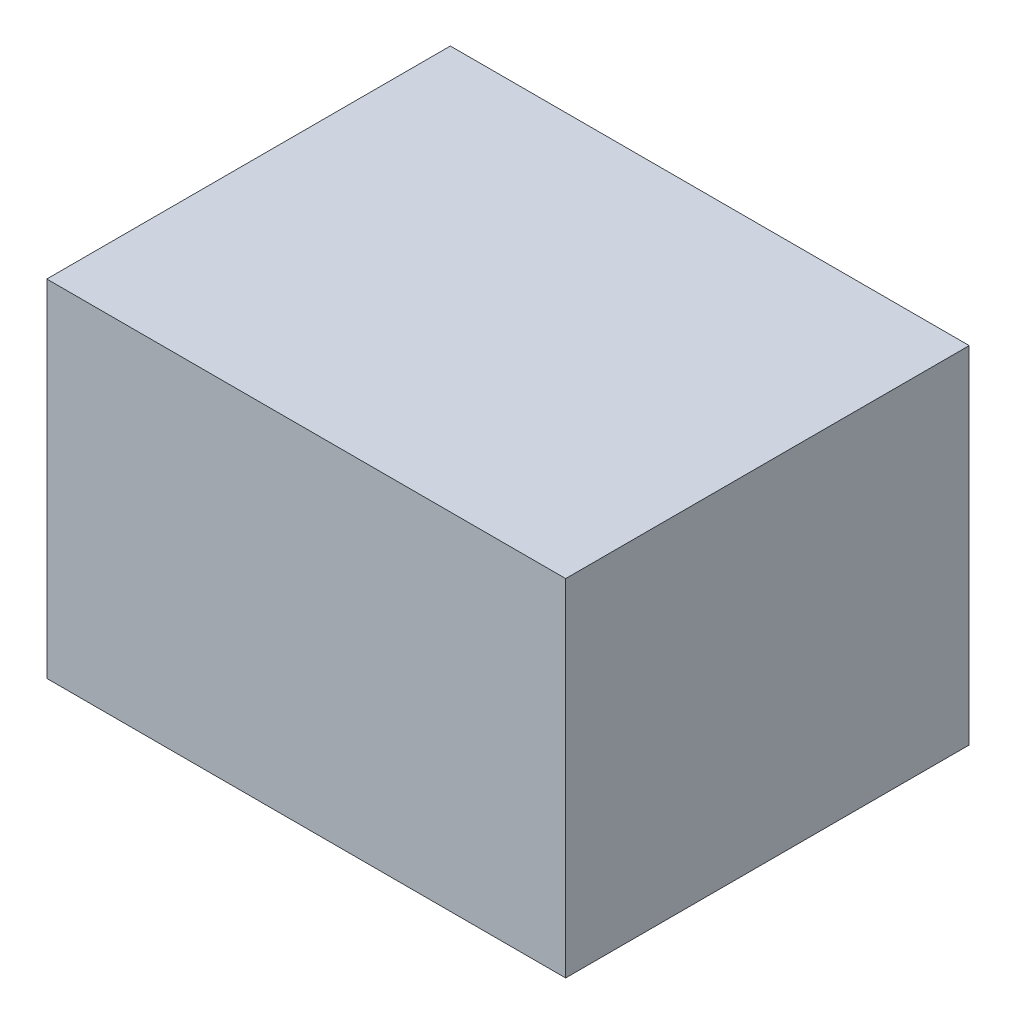
ISO-10303-21;
HEADER;
FILE_DESCRIPTION(('STEP AP214'),'2;1');
FILE_NAME('part.step','',(''),(''),'','','');
FILE_SCHEMA(('AUTOMOTIVE_DESIGN { 1 0 10303 214 1 1 1 1 }'));
ENDSEC;
DATA;
#1=APPLICATION_CONTEXT('core data for automotive mechanical design processes');
#2=APPLICATION_PROTOCOL_DEFINITION('international standard','automotive_design',2000,#1);
#3=PRODUCT_CONTEXT('',#1,'mechanical');
#4=PRODUCT('Part','Part','',(#3));
#5=PRODUCT_RELATED_PRODUCT_CATEGORY('part','',(#4));
#6=PRODUCT_DEFINITION_FORMATION('','',#4);
#7=PRODUCT_DEFINITION_CONTEXT('part definition',#1,'design');
#8=PRODUCT_DEFINITION('design','',#6,#7);
#9=PRODUCT_DEFINITION_SHAPE('','',#8);
#10=(LENGTH_UNIT() NAMED_UNIT(*) SI_UNIT(.MILLI.,.METRE.));
#11=(NAMED_UNIT(*) PLANE_ANGLE_UNIT() SI_UNIT($,.RADIAN.));
#12=(NAMED_UNIT(*) SI_UNIT($,.STERADIAN.) SOLID_ANGLE_UNIT());
#13=UNCERTAINTY_MEASURE_WITH_UNIT(LENGTH_MEASURE(1.E-05),#10,'distance_accuracy_value','');
#14=(GEOMETRIC_REPRESENTATION_CONTEXT(3) GLOBAL_UNCERTAINTY_ASSIGNED_CONTEXT((#13)) GLOBAL_UNIT_ASSIGNED_CONTEXT((#10,
#11,#12)) REPRESENTATION_CONTEXT('',''));
#15=CARTESIAN_POINT('',(0.,0.,0.));
#16=DIRECTION('',(0.,0.,1.));
#17=DIRECTION('',(1.,0.,0.));
#18=AXIS2_PLACEMENT_3D('',#15,#16,#17);
#19=CARTESIAN_POINT('',(-22.5,-15.,35.));
#20=DIRECTION('',(-1.,0.,0.));
#21=DIRECTION('',(0.,0.,1.));
#22=AXIS2_PLACEMENT_3D('',#19,#20,#21);
#23=PLANE('',#22);
#24=DIRECTION('',(0.,1.,0.));
#25=VECTOR('',#24,1.);
#26=CARTESIAN_POINT('',(-22.5,-15.,0.));
#27=LINE('',#26,#25);
#28=CARTESIAN_POINT('',(-22.5,-15.,0.));
#29=VERTEX_POINT('',#28);
#30=CARTESIAN_POINT('',(-22.5,15.,0.));
#31=VERTEX_POINT('',#30);
#32=EDGE_CURVE('E98',#29,#31,#27,.T.);
#33=ORIENTED_EDGE('',*,*,#32,.F.);
#34=DIRECTION('',(0.,0.,-1.));
#35=VECTOR('',#34,1.);
#36=CARTESIAN_POINT('',(-22.5,-15.,35.));
#37=LINE('',#36,#35);
#38=CARTESIAN_POINT('',(-22.5,-15.,35.));
#39=VERTEX_POINT('',#38);
#40=EDGE_CURVE('E11',#39,#29,#37,.T.);
#41=ORIENTED_EDGE('',*,*,#40,.F.);
#42=DIRECTION('',(0.,1.,0.));
#43=VECTOR('',#42,1.);
#44=CARTESIAN_POINT('',(-22.5,-15.,35.));
#45=LINE('',#44,#43);
#46=CARTESIAN_POINT('',(-22.5,15.,35.));
#47=VERTEX_POINT('',#46);
#48=EDGE_CURVE('E93',#39,#47,#45,.T.);
#49=ORIENTED_EDGE('',*,*,#48,.T.);
#50=DIRECTION('',(0.,0.,-1.));
#51=VECTOR('',#50,1.);
#52=CARTESIAN_POINT('',(-22.5,15.,35.));
#53=LINE('',#52,#51);
#54=EDGE_CURVE('E36',#47,#31,#53,.T.);
#55=ORIENTED_EDGE('',*,*,#54,.T.);
#56=EDGE_LOOP('',(#33,#41,#49,#55));
#57=FACE_BOUND('',#56,.T.);
#58=ADVANCED_FACE('F33',(#57),#23,.T.);
#59=CARTESIAN_POINT('',(-22.5,-15.,35.));
#60=DIRECTION('',(0.,1.,0.));
#61=DIRECTION('',(0.,0.,1.));
#62=AXIS2_PLACEMENT_3D('',#59,#60,#61);
#63=PLANE('',#62);
#64=DIRECTION('',(1.,0.,0.));
#65=VECTOR('',#64,1.);
#66=CARTESIAN_POINT('',(-22.5,-15.,0.));
#67=LINE('',#66,#65);
#68=CARTESIAN_POINT('',(22.5,-15.,0.));
#69=VERTEX_POINT('',#68);
#70=EDGE_CURVE('E66',#29,#69,#67,.T.);
#71=ORIENTED_EDGE('',*,*,#70,.T.);
#72=DIRECTION('',(0.,0.,-1.));
#73=VECTOR('',#72,1.);
#74=CARTESIAN_POINT('',(22.5,-15.,35.));
#75=LINE('',#74,#73);
#76=CARTESIAN_POINT('',(22.5,-15.,35.));
#77=VERTEX_POINT('',#76);
#78=EDGE_CURVE('E42',#77,#69,#75,.T.);
#79=ORIENTED_EDGE('',*,*,#78,.F.);
#80=DIRECTION('',(1.,0.,0.));
#81=VECTOR('',#80,1.);
#82=CARTESIAN_POINT('',(-22.5,-15.,35.));
#83=LINE('',#82,#81);
#84=EDGE_CURVE('E83',#39,#77,#83,.T.);
#85=ORIENTED_EDGE('',*,*,#84,.F.);
#86=ORIENTED_EDGE('',*,*,#40,.T.);
#87=EDGE_LOOP('',(#71,#79,#85,#86));
#88=FACE_BOUND('',#87,.T.);
#89=ADVANCED_FACE('F108',(#88),#63,.F.);
#90=CARTESIAN_POINT('',(22.5,-15.,35.));
#91=DIRECTION('',(-1.,0.,0.));
#92=DIRECTION('',(0.,0.,1.));
#93=AXIS2_PLACEMENT_3D('',#90,#91,#92);
#94=PLANE('',#93);
#95=DIRECTION('',(0.,1.,0.));
#96=VECTOR('',#95,1.);
#97=CARTESIAN_POINT('',(22.5,-15.,0.));
#98=LINE('',#97,#96);
#99=CARTESIAN_POINT('',(22.5,15.,0.));
#100=VERTEX_POINT('',#99);
#101=EDGE_CURVE('E90',#69,#100,#98,.T.);
#102=ORIENTED_EDGE('',*,*,#101,.T.);
#103=DIRECTION('',(0.,0.,-1.));
#104=VECTOR('',#103,1.);
#105=CARTESIAN_POINT('',(22.5,15.,35.));
#106=LINE('',#105,#104);
#107=CARTESIAN_POINT('',(22.5,15.,35.));
#108=VERTEX_POINT('',#107);
#109=EDGE_CURVE('E87',#108,#100,#106,.T.);
#110=ORIENTED_EDGE('',*,*,#109,.F.);
#111=DIRECTION('',(0.,1.,0.));
#112=VECTOR('',#111,1.);
#113=CARTESIAN_POINT('',(22.5,-15.,35.));
#114=LINE('',#113,#112);
#115=EDGE_CURVE('E78',#77,#108,#114,.T.);
#116=ORIENTED_EDGE('',*,*,#115,.F.);
#117=ORIENTED_EDGE('',*,*,#78,.T.);
#118=EDGE_LOOP('',(#102,#110,#116,#117));
#119=FACE_BOUND('',#118,.T.);
#120=ADVANCED_FACE('F88',(#119),#94,.F.);
#121=CARTESIAN_POINT('',(-22.5,15.,35.));
#122=DIRECTION('',(0.,1.,0.));
#123=DIRECTION('',(0.,0.,1.));
#124=AXIS2_PLACEMENT_3D('',#121,#122,#123);
#125=PLANE('',#124);
#126=DIRECTION('',(1.,0.,0.));
#127=VECTOR('',#126,1.);
#128=CARTESIAN_POINT('',(-22.5,15.,0.));
#129=LINE('',#128,#127);
#130=EDGE_CURVE('E101',#31,#100,#129,.T.);
#131=ORIENTED_EDGE('',*,*,#130,.F.);
#132=ORIENTED_EDGE('',*,*,#54,.F.);
#133=DIRECTION('',(1.,0.,0.));
#134=VECTOR('',#133,1.);
#135=CARTESIAN_POINT('',(-22.5,15.,35.));
#136=LINE('',#135,#134);
#137=EDGE_CURVE('E82',#47,#108,#136,.T.);
#138=ORIENTED_EDGE('',*,*,#137,.T.);
#139=ORIENTED_EDGE('',*,*,#109,.T.);
#140=EDGE_LOOP('',(#131,#132,#138,#139));
#141=FACE_BOUND('',#140,.T.);
#142=ADVANCED_FACE('F92',(#141),#125,.T.);
#143=CARTESIAN_POINT('',(0.,0.,35.));
#144=DIRECTION('',(0.,0.,-1.));
#145=DIRECTION('',(-1.,0.,0.));
#146=AXIS2_PLACEMENT_3D('',#143,#144,#145);
#147=PLANE('',#146);
#148=ORIENTED_EDGE('',*,*,#48,.F.);
#149=ORIENTED_EDGE('',*,*,#84,.T.);
#150=ORIENTED_EDGE('',*,*,#115,.T.);
#151=ORIENTED_EDGE('',*,*,#137,.F.);
#152=EDGE_LOOP('',(#148,#149,#150,#151));
#153=FACE_BOUND('',#152,.T.);
#154=ADVANCED_FACE('F81',(#153),#147,.F.);
#155=CARTESIAN_POINT('',(0.,0.,0.));
#156=DIRECTION('',(0.,0.,-1.));
#157=DIRECTION('',(-1.,0.,0.));
#158=AXIS2_PLACEMENT_3D('',#155,#156,#157);
#159=PLANE('',#158);
#160=ORIENTED_EDGE('',*,*,#32,.T.);
#161=ORIENTED_EDGE('',*,*,#130,.T.);
#162=ORIENTED_EDGE('',*,*,#101,.F.);
#163=ORIENTED_EDGE('',*,*,#70,.F.);
#164=EDGE_LOOP('',(#160,#161,#162,#163));
#165=FACE_BOUND('',#164,.T.);
#166=ADVANCED_FACE('F106',(#165),#159,.T.);
#167=CLOSED_SHELL('',(#58,#89,#120,#142,#154,#166));
#168=MANIFOLD_SOLID_BREP('B2',#167);
#169=ADVANCED_BREP_SHAPE_REPRESENTATION('',(#18,#168),#14);
#170=SHAPE_DEFINITION_REPRESENTATION(#9,#169);
ENDSEC;
END-ISO-10303-21;
